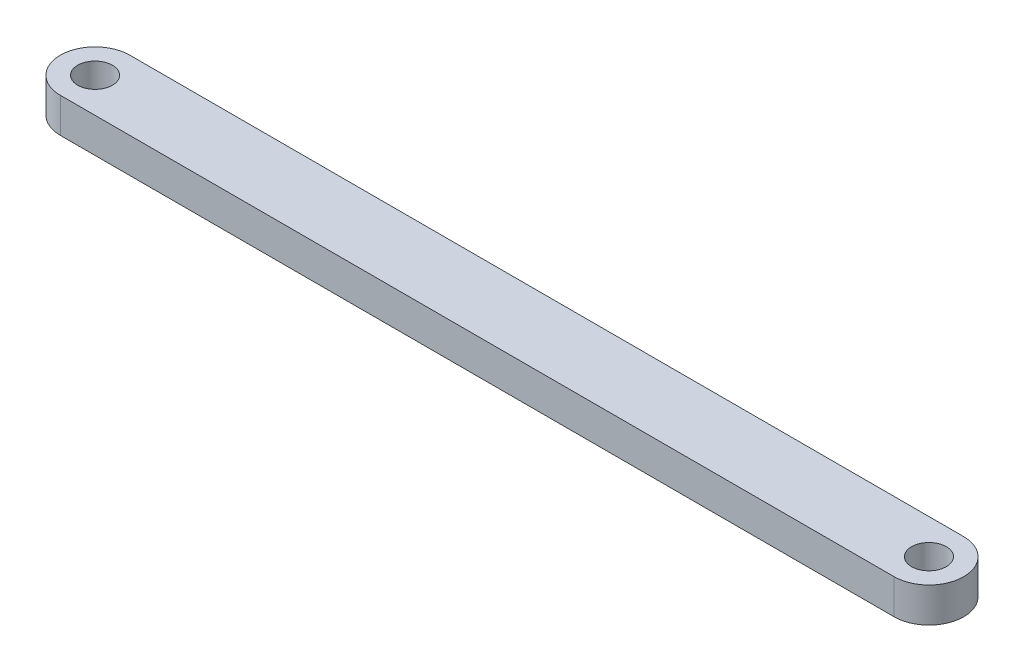
ISO-10303-21;
HEADER;
FILE_DESCRIPTION(('STEP AP214'),'2;1');
FILE_NAME('part.step','',(''),(''),'','','');
FILE_SCHEMA(('AUTOMOTIVE_DESIGN { 1 0 10303 214 1 1 1 1 }'));
ENDSEC;
DATA;
#1=APPLICATION_CONTEXT('core data for automotive mechanical design processes');
#2=APPLICATION_PROTOCOL_DEFINITION('international standard','automotive_design',2000,#1);
#3=PRODUCT_CONTEXT('',#1,'mechanical');
#4=PRODUCT('Part','Part','',(#3));
#5=PRODUCT_RELATED_PRODUCT_CATEGORY('part','',(#4));
#6=PRODUCT_DEFINITION_FORMATION('','',#4);
#7=PRODUCT_DEFINITION_CONTEXT('part definition',#1,'design');
#8=PRODUCT_DEFINITION('design','',#6,#7);
#9=PRODUCT_DEFINITION_SHAPE('','',#8);
#10=(LENGTH_UNIT() NAMED_UNIT(*) SI_UNIT(.MILLI.,.METRE.));
#11=(NAMED_UNIT(*) PLANE_ANGLE_UNIT() SI_UNIT($,.RADIAN.));
#12=(NAMED_UNIT(*) SI_UNIT($,.STERADIAN.) SOLID_ANGLE_UNIT());
#13=UNCERTAINTY_MEASURE_WITH_UNIT(LENGTH_MEASURE(1.E-05),#10,'distance_accuracy_value','');
#14=(GEOMETRIC_REPRESENTATION_CONTEXT(3) GLOBAL_UNCERTAINTY_ASSIGNED_CONTEXT((#13)) GLOBAL_UNIT_ASSIGNED_CONTEXT((#10,
#11,#12)) REPRESENTATION_CONTEXT('',''));
#15=CARTESIAN_POINT('',(0.,0.,0.));
#16=DIRECTION('',(0.,0.,1.));
#17=DIRECTION('',(1.,0.,0.));
#18=AXIS2_PLACEMENT_3D('',#15,#16,#17);
#19=CARTESIAN_POINT('',(-60.,5.,0.));
#20=DIRECTION('',(0.,1.,0.));
#21=DIRECTION('',(0.,0.,1.));
#22=AXIS2_PLACEMENT_3D('',#19,#20,#21);
#23=PLANE('',#22);
#24=CARTESIAN_POINT('',(-60.,5.,0.));
#25=DIRECTION('',(0.,1.,0.));
#26=DIRECTION('',(0.,0.,1.));
#27=AXIS2_PLACEMENT_3D('',#24,#25,#26);
#28=CIRCLE('',#27,2.5);
#29=CARTESIAN_POINT('',(-60.,5.,2.5));
#30=VERTEX_POINT('',#29);
#31=EDGE_CURVE('E112',#30,#30,#28,.T.);
#32=ORIENTED_EDGE('',*,*,#31,.F.);
#33=EDGE_LOOP('',(#32));
#34=FACE_BOUND('',#33,.T.);
#35=CARTESIAN_POINT('',(-60.,5.,0.));
#36=DIRECTION('',(0.,1.,0.));
#37=DIRECTION('',(0.,0.,1.));
#38=AXIS2_PLACEMENT_3D('',#35,#36,#37);
#39=CIRCLE('',#38,5.);
#40=CARTESIAN_POINT('',(-60.,5.,-5.));
#41=VERTEX_POINT('',#40);
#42=CARTESIAN_POINT('',(-60.,5.,5.));
#43=VERTEX_POINT('',#42);
#44=EDGE_CURVE('E92',#41,#43,#39,.T.);
#45=ORIENTED_EDGE('',*,*,#44,.T.);
#46=DIRECTION('',(1.,0.,0.));
#47=VECTOR('',#46,1.);
#48=CARTESIAN_POINT('',(60.,5.,5.));
#49=LINE('',#48,#47);
#50=CARTESIAN_POINT('',(60.,5.,5.));
#51=VERTEX_POINT('',#50);
#52=EDGE_CURVE('E87',#43,#51,#49,.T.);
#53=ORIENTED_EDGE('',*,*,#52,.T.);
#54=CARTESIAN_POINT('',(60.,5.,0.));
#55=DIRECTION('',(0.,1.,0.));
#56=DIRECTION('',(0.,0.,1.));
#57=AXIS2_PLACEMENT_3D('',#54,#55,#56);
#58=CIRCLE('',#57,5.);
#59=CARTESIAN_POINT('',(60.,5.,-5.));
#60=VERTEX_POINT('',#59);
#61=EDGE_CURVE('E90',#51,#60,#58,.T.);
#62=ORIENTED_EDGE('',*,*,#61,.T.);
#63=DIRECTION('',(-1.,0.,0.));
#64=VECTOR('',#63,1.);
#65=CARTESIAN_POINT('',(60.,5.,-5.));
#66=LINE('',#65,#64);
#67=EDGE_CURVE('E57',#60,#41,#66,.T.);
#68=ORIENTED_EDGE('',*,*,#67,.T.);
#69=EDGE_LOOP('',(#45,#53,#62,#68));
#70=FACE_BOUND('',#69,.T.);
#71=CARTESIAN_POINT('',(60.,5.,0.));
#72=DIRECTION('',(0.,1.,0.));
#73=DIRECTION('',(0.,0.,1.));
#74=AXIS2_PLACEMENT_3D('',#71,#72,#73);
#75=CIRCLE('',#74,2.5);
#76=CARTESIAN_POINT('',(60.,5.,2.5));
#77=VERTEX_POINT('',#76);
#78=EDGE_CURVE('E134',#77,#77,#75,.T.);
#79=ORIENTED_EDGE('',*,*,#78,.F.);
#80=EDGE_LOOP('',(#79));
#81=FACE_BOUND('',#80,.T.);
#82=ADVANCED_FACE('F39',(#34,#70,#81),#23,.T.);
#83=CARTESIAN_POINT('',(-60.,0.,0.));
#84=DIRECTION('',(0.,1.,0.));
#85=DIRECTION('',(0.,0.,1.));
#86=AXIS2_PLACEMENT_3D('',#83,#84,#85);
#87=PLANE('',#86);
#88=CARTESIAN_POINT('',(-60.,0.,0.));
#89=DIRECTION('',(0.,1.,0.));
#90=DIRECTION('',(0.,0.,1.));
#91=AXIS2_PLACEMENT_3D('',#88,#89,#90);
#92=CIRCLE('',#91,5.);
#93=CARTESIAN_POINT('',(-60.,0.,-5.));
#94=VERTEX_POINT('',#93);
#95=CARTESIAN_POINT('',(-60.,0.,5.));
#96=VERTEX_POINT('',#95);
#97=EDGE_CURVE('E108',#94,#96,#92,.T.);
#98=ORIENTED_EDGE('',*,*,#97,.F.);
#99=DIRECTION('',(-1.,0.,0.));
#100=VECTOR('',#99,1.);
#101=CARTESIAN_POINT('',(60.,0.,-5.));
#102=LINE('',#101,#100);
#103=CARTESIAN_POINT('',(60.,0.,-5.));
#104=VERTEX_POINT('',#103);
#105=EDGE_CURVE('E80',#104,#94,#102,.T.);
#106=ORIENTED_EDGE('',*,*,#105,.F.);
#107=CARTESIAN_POINT('',(60.,0.,0.));
#108=DIRECTION('',(0.,1.,0.));
#109=DIRECTION('',(0.,0.,1.));
#110=AXIS2_PLACEMENT_3D('',#107,#108,#109);
#111=CIRCLE('',#110,5.);
#112=CARTESIAN_POINT('',(60.,0.,5.));
#113=VERTEX_POINT('',#112);
#114=EDGE_CURVE('E74',#113,#104,#111,.T.);
#115=ORIENTED_EDGE('',*,*,#114,.F.);
#116=DIRECTION('',(1.,0.,0.));
#117=VECTOR('',#116,1.);
#118=CARTESIAN_POINT('',(60.,0.,5.));
#119=LINE('',#118,#117);
#120=EDGE_CURVE('E97',#96,#113,#119,.T.);
#121=ORIENTED_EDGE('',*,*,#120,.F.);
#122=EDGE_LOOP('',(#98,#106,#115,#121));
#123=FACE_BOUND('',#122,.T.);
#124=CARTESIAN_POINT('',(-60.,0.,0.));
#125=DIRECTION('',(0.,1.,0.));
#126=DIRECTION('',(0.,0.,1.));
#127=AXIS2_PLACEMENT_3D('',#124,#125,#126);
#128=CIRCLE('',#127,2.5);
#129=CARTESIAN_POINT('',(-60.,0.,2.5));
#130=VERTEX_POINT('',#129);
#131=EDGE_CURVE('E130',#130,#130,#128,.T.);
#132=ORIENTED_EDGE('',*,*,#131,.T.);
#133=EDGE_LOOP('',(#132));
#134=FACE_BOUND('',#133,.T.);
#135=CARTESIAN_POINT('',(60.,0.,0.));
#136=DIRECTION('',(0.,1.,0.));
#137=DIRECTION('',(0.,0.,1.));
#138=AXIS2_PLACEMENT_3D('',#135,#136,#137);
#139=CIRCLE('',#138,2.5);
#140=CARTESIAN_POINT('',(60.,0.,2.5));
#141=VERTEX_POINT('',#140);
#142=EDGE_CURVE('E138',#141,#141,#139,.T.);
#143=ORIENTED_EDGE('',*,*,#142,.T.);
#144=EDGE_LOOP('',(#143));
#145=FACE_BOUND('',#144,.T.);
#146=ADVANCED_FACE('F125',(#123,#134,#145),#87,.F.);
#147=CARTESIAN_POINT('',(-60.,5.,0.));
#148=DIRECTION('',(0.,-1.,0.));
#149=DIRECTION('',(0.,0.,-1.));
#150=AXIS2_PLACEMENT_3D('',#147,#148,#149);
#151=CYLINDRICAL_SURFACE('',#150,5.);
#152=ORIENTED_EDGE('',*,*,#97,.T.);
#153=DIRECTION('',(0.,-1.,0.));
#154=VECTOR('',#153,1.);
#155=CARTESIAN_POINT('',(-60.,5.,5.));
#156=LINE('',#155,#154);
#157=EDGE_CURVE('E11',#43,#96,#156,.T.);
#158=ORIENTED_EDGE('',*,*,#157,.F.);
#159=ORIENTED_EDGE('',*,*,#44,.F.);
#160=DIRECTION('',(0.,-1.,0.));
#161=VECTOR('',#160,1.);
#162=CARTESIAN_POINT('',(-60.,5.,-5.));
#163=LINE('',#162,#161);
#164=EDGE_CURVE('E104',#41,#94,#163,.T.);
#165=ORIENTED_EDGE('',*,*,#164,.T.);
#166=EDGE_LOOP('',(#152,#158,#159,#165));
#167=FACE_BOUND('',#166,.T.);
#168=ADVANCED_FACE('F41',(#167),#151,.T.);
#169=CARTESIAN_POINT('',(60.,5.,5.));
#170=DIRECTION('',(0.,0.,-1.));
#171=DIRECTION('',(-1.,0.,0.));
#172=AXIS2_PLACEMENT_3D('',#169,#170,#171);
#173=PLANE('',#172);
#174=ORIENTED_EDGE('',*,*,#120,.T.);
#175=DIRECTION('',(0.,-1.,0.));
#176=VECTOR('',#175,1.);
#177=CARTESIAN_POINT('',(60.,5.,5.));
#178=LINE('',#177,#176);
#179=EDGE_CURVE('E49',#51,#113,#178,.T.);
#180=ORIENTED_EDGE('',*,*,#179,.F.);
#181=ORIENTED_EDGE('',*,*,#52,.F.);
#182=ORIENTED_EDGE('',*,*,#157,.T.);
#183=EDGE_LOOP('',(#174,#180,#181,#182));
#184=FACE_BOUND('',#183,.T.);
#185=ADVANCED_FACE('F96',(#184),#173,.F.);
#186=CARTESIAN_POINT('',(60.,5.,0.));
#187=DIRECTION('',(0.,-1.,0.));
#188=DIRECTION('',(0.,0.,-1.));
#189=AXIS2_PLACEMENT_3D('',#186,#187,#188);
#190=CYLINDRICAL_SURFACE('',#189,5.);
#191=ORIENTED_EDGE('',*,*,#114,.T.);
#192=DIRECTION('',(0.,-1.,0.));
#193=VECTOR('',#192,1.);
#194=CARTESIAN_POINT('',(60.,5.,-5.));
#195=LINE('',#194,#193);
#196=EDGE_CURVE('E99',#60,#104,#195,.T.);
#197=ORIENTED_EDGE('',*,*,#196,.F.);
#198=ORIENTED_EDGE('',*,*,#61,.F.);
#199=ORIENTED_EDGE('',*,*,#179,.T.);
#200=EDGE_LOOP('',(#191,#197,#198,#199));
#201=FACE_BOUND('',#200,.T.);
#202=ADVANCED_FACE('F100',(#201),#190,.T.);
#203=CARTESIAN_POINT('',(60.,5.,-5.));
#204=DIRECTION('',(0.,0.,1.));
#205=DIRECTION('',(1.,0.,0.));
#206=AXIS2_PLACEMENT_3D('',#203,#204,#205);
#207=PLANE('',#206);
#208=ORIENTED_EDGE('',*,*,#105,.T.);
#209=ORIENTED_EDGE('',*,*,#164,.F.);
#210=ORIENTED_EDGE('',*,*,#67,.F.);
#211=ORIENTED_EDGE('',*,*,#196,.T.);
#212=EDGE_LOOP('',(#208,#209,#210,#211));
#213=FACE_BOUND('',#212,.T.);
#214=ADVANCED_FACE('F122',(#213),#207,.F.);
#215=CARTESIAN_POINT('',(-60.,5.,0.));
#216=DIRECTION('',(0.,-1.,0.));
#217=DIRECTION('',(0.,0.,-1.));
#218=AXIS2_PLACEMENT_3D('',#215,#216,#217);
#219=CYLINDRICAL_SURFACE('',#218,2.5);
#220=ORIENTED_EDGE('',*,*,#31,.T.);
#221=EDGE_LOOP('',(#220));
#222=FACE_BOUND('',#221,.T.);
#223=ORIENTED_EDGE('',*,*,#131,.F.);
#224=EDGE_LOOP('',(#223));
#225=FACE_BOUND('',#224,.T.);
#226=ADVANCED_FACE('F157',(#222,#225),#219,.F.);
#227=CARTESIAN_POINT('',(60.,5.,0.));
#228=DIRECTION('',(0.,-1.,0.));
#229=DIRECTION('',(0.,0.,-1.));
#230=AXIS2_PLACEMENT_3D('',#227,#228,#229);
#231=CYLINDRICAL_SURFACE('',#230,2.5);
#232=ORIENTED_EDGE('',*,*,#78,.T.);
#233=EDGE_LOOP('',(#232));
#234=FACE_BOUND('',#233,.T.);
#235=ORIENTED_EDGE('',*,*,#142,.F.);
#236=EDGE_LOOP('',(#235));
#237=FACE_BOUND('',#236,.T.);
#238=ADVANCED_FACE('F146',(#234,#237),#231,.F.);
#239=CLOSED_SHELL('',(#82,#146,#168,#185,#202,#214,#226,#238));
#240=MANIFOLD_SOLID_BREP('B2',#239);
#241=ADVANCED_BREP_SHAPE_REPRESENTATION('',(#18,#240),#14);
#242=SHAPE_DEFINITION_REPRESENTATION(#9,#241);
ENDSEC;
END-ISO-10303-21;
